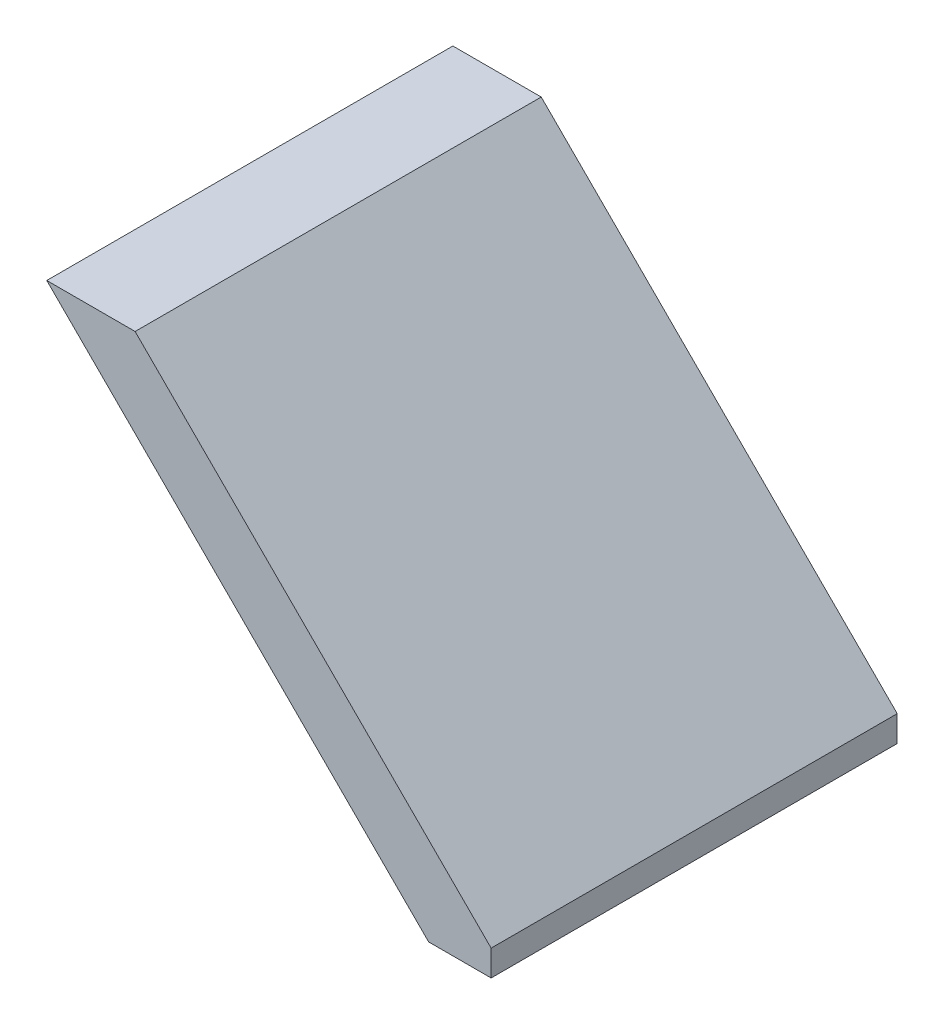
ISO-10303-21;
HEADER;
FILE_DESCRIPTION(('STEP AP214'),'2;1');
FILE_NAME('part.step','',(''),(''),'','','');
FILE_SCHEMA(('AUTOMOTIVE_DESIGN { 1 0 10303 214 1 1 1 1 }'));
ENDSEC;
DATA;
#1=APPLICATION_CONTEXT('core data for automotive mechanical design processes');
#2=APPLICATION_PROTOCOL_DEFINITION('international standard','automotive_design',2000,#1);
#3=PRODUCT_CONTEXT('',#1,'mechanical');
#4=PRODUCT('Part','Part','',(#3));
#5=PRODUCT_RELATED_PRODUCT_CATEGORY('part','',(#4));
#6=PRODUCT_DEFINITION_FORMATION('','',#4);
#7=PRODUCT_DEFINITION_CONTEXT('part definition',#1,'design');
#8=PRODUCT_DEFINITION('design','',#6,#7);
#9=PRODUCT_DEFINITION_SHAPE('','',#8);
#10=(LENGTH_UNIT() NAMED_UNIT(*) SI_UNIT(.MILLI.,.METRE.));
#11=(NAMED_UNIT(*) PLANE_ANGLE_UNIT() SI_UNIT($,.RADIAN.));
#12=(NAMED_UNIT(*) SI_UNIT($,.STERADIAN.) SOLID_ANGLE_UNIT());
#13=UNCERTAINTY_MEASURE_WITH_UNIT(LENGTH_MEASURE(1.E-05),#10,'distance_accuracy_value','');
#14=(GEOMETRIC_REPRESENTATION_CONTEXT(3) GLOBAL_UNCERTAINTY_ASSIGNED_CONTEXT((#13)) GLOBAL_UNIT_ASSIGNED_CONTEXT((#10,
#11,#12)) REPRESENTATION_CONTEXT('',''));
#15=CARTESIAN_POINT('',(0.,0.,0.));
#16=DIRECTION('',(0.,0.,1.));
#17=DIRECTION('',(1.,0.,0.));
#18=AXIS2_PLACEMENT_3D('',#15,#16,#17);
#19=CARTESIAN_POINT('',(-220.805892875932,103.45,-26.));
#20=DIRECTION('',(0.,0.,-1.));
#21=DIRECTION('',(0.,-1.,0.));
#22=AXIS2_PLACEMENT_3D('',#19,#20,#21);
#23=PLANE('',#22);
#24=DIRECTION('',(0.,1.,0.));
#25=VECTOR('',#24,1.);
#26=CARTESIAN_POINT('',(-75.,76.6568542494924,-26.));
#27=LINE('',#26,#25);
#28=CARTESIAN_POINT('',(-75.,75.,-26.));
#29=VERTEX_POINT('',#28);
#30=CARTESIAN_POINT('',(-75.,76.6568542494924,-26.));
#31=VERTEX_POINT('',#30);
#32=EDGE_CURVE('E41',#29,#31,#27,.T.);
#33=ORIENTED_EDGE('',*,*,#32,.F.);
#34=DIRECTION('',(1.,0.,0.));
#35=VECTOR('',#34,1.);
#36=CARTESIAN_POINT('',(-79.,75.,-26.));
#37=LINE('',#36,#35);
#38=CARTESIAN_POINT('',(-79.,75.,-26.));
#39=VERTEX_POINT('',#38);
#40=EDGE_CURVE('E109',#39,#29,#37,.T.);
#41=ORIENTED_EDGE('',*,*,#40,.F.);
#42=DIRECTION('',(0.707106781186541,-0.707106781186554,0.));
#43=VECTOR('',#42,1.);
#44=CARTESIAN_POINT('',(-79.,75.,-26.));
#45=LINE('',#44,#43);
#46=CARTESIAN_POINT('',(-103.45,99.45,-26.));
#47=VERTEX_POINT('',#46);
#48=EDGE_CURVE('E67',#47,#39,#45,.T.);
#49=ORIENTED_EDGE('',*,*,#48,.F.);
#50=DIRECTION('',(-1.,0.,0.));
#51=VECTOR('',#50,1.);
#52=CARTESIAN_POINT('',(-103.45,99.45,-26.));
#53=LINE('',#52,#51);
#54=CARTESIAN_POINT('',(-97.7931457505072,99.45,-26.));
#55=VERTEX_POINT('',#54);
#56=EDGE_CURVE('E72',#55,#47,#53,.T.);
#57=ORIENTED_EDGE('',*,*,#56,.F.);
#58=DIRECTION('',(-0.707106781186541,0.707106781186554,0.));
#59=VECTOR('',#58,1.);
#60=CARTESIAN_POINT('',(-97.7931457505072,99.45,-26.));
#61=LINE('',#60,#59);
#62=EDGE_CURVE('E90',#31,#55,#61,.T.);
#63=ORIENTED_EDGE('',*,*,#62,.F.);
#64=EDGE_LOOP('',(#33,#41,#49,#57,#63));
#65=FACE_BOUND('',#64,.T.);
#66=ADVANCED_FACE('F33',(#65),#23,.T.);
#67=CARTESIAN_POINT('',(0.,0.,0.));
#68=DIRECTION('',(0.,0.,1.));
#69=DIRECTION('',(1.,0.,0.));
#70=AXIS2_PLACEMENT_3D('',#67,#68,#69);
#71=PLANE('',#70);
#72=DIRECTION('',(0.,1.,0.));
#73=VECTOR('',#72,1.);
#74=CARTESIAN_POINT('',(-75.,76.6568542494924,0.));
#75=LINE('',#74,#73);
#76=CARTESIAN_POINT('',(-75.,75.,0.));
#77=VERTEX_POINT('',#76);
#78=CARTESIAN_POINT('',(-75.,76.6568542494924,0.));
#79=VERTEX_POINT('',#78);
#80=EDGE_CURVE('E100',#77,#79,#75,.T.);
#81=ORIENTED_EDGE('',*,*,#80,.T.);
#82=DIRECTION('',(-0.707106781186541,0.707106781186554,0.));
#83=VECTOR('',#82,1.);
#84=CARTESIAN_POINT('',(-97.7931457505072,99.45,0.));
#85=LINE('',#84,#83);
#86=CARTESIAN_POINT('',(-97.7931457505072,99.45,0.));
#87=VERTEX_POINT('',#86);
#88=EDGE_CURVE('E88',#79,#87,#85,.T.);
#89=ORIENTED_EDGE('',*,*,#88,.T.);
#90=DIRECTION('',(-1.,0.,0.));
#91=VECTOR('',#90,1.);
#92=CARTESIAN_POINT('',(-103.45,99.45,0.));
#93=LINE('',#92,#91);
#94=CARTESIAN_POINT('',(-103.45,99.45,0.));
#95=VERTEX_POINT('',#94);
#96=EDGE_CURVE('E92',#87,#95,#93,.T.);
#97=ORIENTED_EDGE('',*,*,#96,.T.);
#98=DIRECTION('',(0.707106781186541,-0.707106781186554,0.));
#99=VECTOR('',#98,1.);
#100=CARTESIAN_POINT('',(-79.,75.,0.));
#101=LINE('',#100,#99);
#102=CARTESIAN_POINT('',(-79.,75.,0.));
#103=VERTEX_POINT('',#102);
#104=EDGE_CURVE('E96',#95,#103,#101,.T.);
#105=ORIENTED_EDGE('',*,*,#104,.T.);
#106=DIRECTION('',(1.,0.,0.));
#107=VECTOR('',#106,1.);
#108=CARTESIAN_POINT('',(-79.,75.,0.));
#109=LINE('',#108,#107);
#110=EDGE_CURVE('E106',#103,#77,#109,.T.);
#111=ORIENTED_EDGE('',*,*,#110,.T.);
#112=EDGE_LOOP('',(#81,#89,#97,#105,#111));
#113=FACE_BOUND('',#112,.T.);
#114=ADVANCED_FACE('F98',(#113),#71,.T.);
#115=CARTESIAN_POINT('',(-97.7931457505072,99.45,-63.5127311722296));
#116=DIRECTION('',(0.707106781186554,0.707106781186541,0.));
#117=DIRECTION('',(-0.707106781186541,0.707106781186554,0.));
#118=AXIS2_PLACEMENT_3D('',#115,#116,#117);
#119=PLANE('',#118);
#120=DIRECTION('',(0.,0.,1.));
#121=VECTOR('',#120,1.);
#122=CARTESIAN_POINT('',(-75.,76.6568542494924,-63.5127311722296));
#123=LINE('',#122,#121);
#124=EDGE_CURVE('E11',#31,#79,#123,.T.);
#125=ORIENTED_EDGE('',*,*,#124,.F.);
#126=ORIENTED_EDGE('',*,*,#62,.T.);
#127=DIRECTION('',(0.,0.,1.));
#128=VECTOR('',#127,1.);
#129=CARTESIAN_POINT('',(-97.7931457505072,99.45,-63.5127311722296));
#130=LINE('',#129,#128);
#131=EDGE_CURVE('E85',#55,#87,#130,.T.);
#132=ORIENTED_EDGE('',*,*,#131,.T.);
#133=ORIENTED_EDGE('',*,*,#88,.F.);
#134=EDGE_LOOP('',(#125,#126,#132,#133));
#135=FACE_BOUND('',#134,.T.);
#136=ADVANCED_FACE('F86',(#135),#119,.T.);
#137=CARTESIAN_POINT('',(-103.45,99.45,-63.5127311722296));
#138=DIRECTION('',(0.,1.,0.));
#139=DIRECTION('',(0.,0.,1.));
#140=AXIS2_PLACEMENT_3D('',#137,#138,#139);
#141=PLANE('',#140);
#142=ORIENTED_EDGE('',*,*,#131,.F.);
#143=ORIENTED_EDGE('',*,*,#56,.T.);
#144=DIRECTION('',(0.,0.,1.));
#145=VECTOR('',#144,1.);
#146=CARTESIAN_POINT('',(-103.45,99.45,-63.5127311722296));
#147=LINE('',#146,#145);
#148=EDGE_CURVE('E80',#47,#95,#147,.T.);
#149=ORIENTED_EDGE('',*,*,#148,.T.);
#150=ORIENTED_EDGE('',*,*,#96,.F.);
#151=EDGE_LOOP('',(#142,#143,#149,#150));
#152=FACE_BOUND('',#151,.T.);
#153=ADVANCED_FACE('F93',(#152),#141,.T.);
#154=CARTESIAN_POINT('',(-79.,75.,-63.5127311722296));
#155=DIRECTION('',(-0.707106781186554,-0.707106781186541,0.));
#156=DIRECTION('',(0.707106781186541,-0.707106781186554,0.));
#157=AXIS2_PLACEMENT_3D('',#154,#155,#156);
#158=PLANE('',#157);
#159=ORIENTED_EDGE('',*,*,#148,.F.);
#160=ORIENTED_EDGE('',*,*,#48,.T.);
#161=DIRECTION('',(0.,0.,1.));
#162=VECTOR('',#161,1.);
#163=CARTESIAN_POINT('',(-79.,75.,-63.5127311722296));
#164=LINE('',#163,#162);
#165=EDGE_CURVE('E112',#39,#103,#164,.T.);
#166=ORIENTED_EDGE('',*,*,#165,.T.);
#167=ORIENTED_EDGE('',*,*,#104,.F.);
#168=EDGE_LOOP('',(#159,#160,#166,#167));
#169=FACE_BOUND('',#168,.T.);
#170=ADVANCED_FACE('F119',(#169),#158,.T.);
#171=CARTESIAN_POINT('',(-79.,75.,-63.5127311722296));
#172=DIRECTION('',(0.,-1.,0.));
#173=DIRECTION('',(1.,0.,0.));
#174=AXIS2_PLACEMENT_3D('',#171,#172,#173);
#175=PLANE('',#174);
#176=ORIENTED_EDGE('',*,*,#165,.F.);
#177=ORIENTED_EDGE('',*,*,#40,.T.);
#178=DIRECTION('',(0.,0.,1.));
#179=VECTOR('',#178,1.);
#180=CARTESIAN_POINT('',(-75.,75.,-63.5127311722296));
#181=LINE('',#180,#179);
#182=EDGE_CURVE('E108',#29,#77,#181,.T.);
#183=ORIENTED_EDGE('',*,*,#182,.T.);
#184=ORIENTED_EDGE('',*,*,#110,.F.);
#185=EDGE_LOOP('',(#176,#177,#183,#184));
#186=FACE_BOUND('',#185,.T.);
#187=ADVANCED_FACE('F122',(#186),#175,.T.);
#188=CARTESIAN_POINT('',(-75.,76.6568542494924,-63.5127311722296));
#189=DIRECTION('',(1.,0.,0.));
#190=DIRECTION('',(0.,0.,-1.));
#191=AXIS2_PLACEMENT_3D('',#188,#189,#190);
#192=PLANE('',#191);
#193=ORIENTED_EDGE('',*,*,#182,.F.);
#194=ORIENTED_EDGE('',*,*,#32,.T.);
#195=ORIENTED_EDGE('',*,*,#124,.T.);
#196=ORIENTED_EDGE('',*,*,#80,.F.);
#197=EDGE_LOOP('',(#193,#194,#195,#196));
#198=FACE_BOUND('',#197,.T.);
#199=ADVANCED_FACE('F125',(#198),#192,.T.);
#200=CLOSED_SHELL('',(#66,#114,#136,#153,#170,#187,#199));
#201=MANIFOLD_SOLID_BREP('B2',#200);
#202=ADVANCED_BREP_SHAPE_REPRESENTATION('',(#18,#201),#14);
#203=SHAPE_DEFINITION_REPRESENTATION(#9,#202);
ENDSEC;
END-ISO-10303-21;
